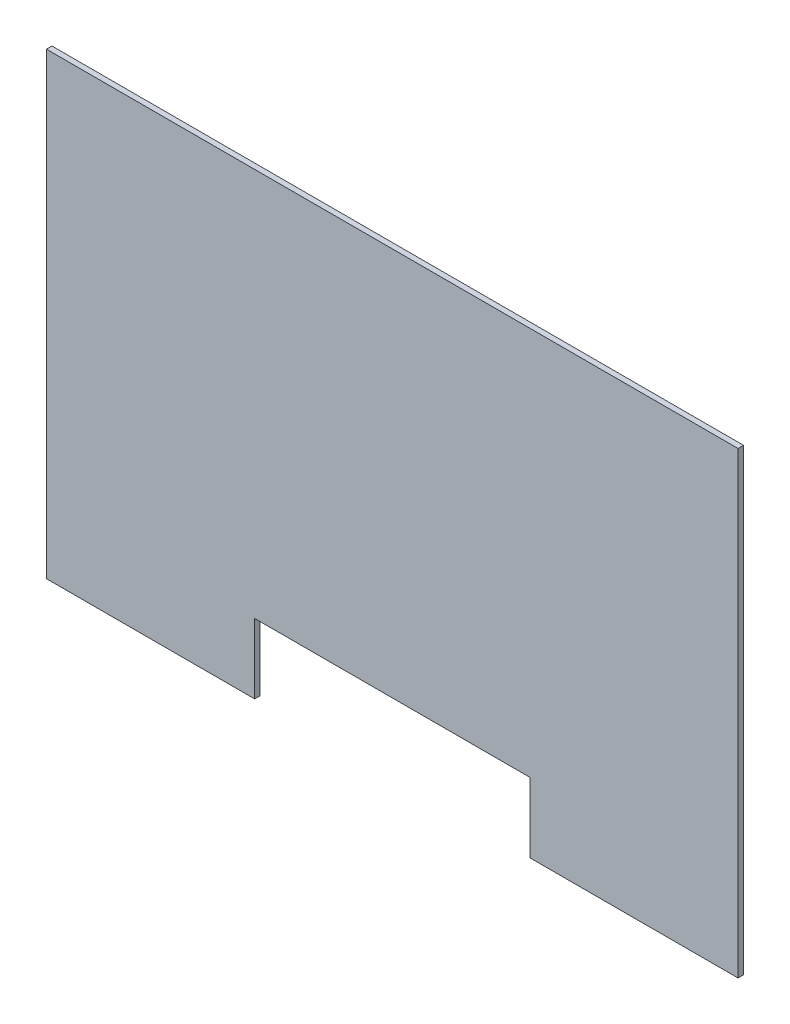
ISO-10303-21;
HEADER;
FILE_DESCRIPTION(('STEP AP214'),'2;1');
FILE_NAME('part.step','',(''),(''),'','','');
FILE_SCHEMA(('AUTOMOTIVE_DESIGN { 1 0 10303 214 1 1 1 1 }'));
ENDSEC;
DATA;
#1=APPLICATION_CONTEXT('core data for automotive mechanical design processes');
#2=APPLICATION_PROTOCOL_DEFINITION('international standard','automotive_design',2000,#1);
#3=PRODUCT_CONTEXT('',#1,'mechanical');
#4=PRODUCT('Part','Part','',(#3));
#5=PRODUCT_RELATED_PRODUCT_CATEGORY('part','',(#4));
#6=PRODUCT_DEFINITION_FORMATION('','',#4);
#7=PRODUCT_DEFINITION_CONTEXT('part definition',#1,'design');
#8=PRODUCT_DEFINITION('design','',#6,#7);
#9=PRODUCT_DEFINITION_SHAPE('','',#8);
#10=(LENGTH_UNIT() NAMED_UNIT(*) SI_UNIT(.MILLI.,.METRE.));
#11=(NAMED_UNIT(*) PLANE_ANGLE_UNIT() SI_UNIT($,.RADIAN.));
#12=(NAMED_UNIT(*) SI_UNIT($,.STERADIAN.) SOLID_ANGLE_UNIT());
#13=UNCERTAINTY_MEASURE_WITH_UNIT(LENGTH_MEASURE(1.E-05),#10,'distance_accuracy_value','');
#14=(GEOMETRIC_REPRESENTATION_CONTEXT(3) GLOBAL_UNCERTAINTY_ASSIGNED_CONTEXT((#13)) GLOBAL_UNIT_ASSIGNED_CONTEXT((#10,
#11,#12)) REPRESENTATION_CONTEXT('',''));
#15=CARTESIAN_POINT('',(0.,0.,0.));
#16=DIRECTION('',(0.,0.,1.));
#17=DIRECTION('',(1.,0.,0.));
#18=AXIS2_PLACEMENT_3D('',#15,#16,#17);
#19=CARTESIAN_POINT('',(-18.85,-12.5,0.3));
#20=DIRECTION('',(0.,1.,0.));
#21=DIRECTION('',(0.,0.,1.));
#22=AXIS2_PLACEMENT_3D('',#19,#20,#21);
#23=PLANE('',#22);
#24=DIRECTION('',(1.,0.,0.));
#25=VECTOR('',#24,1.);
#26=CARTESIAN_POINT('',(-18.85,-12.5,0.));
#27=LINE('',#26,#25);
#28=CARTESIAN_POINT('',(-18.85,-12.5,0.));
#29=VERTEX_POINT('',#28);
#30=CARTESIAN_POINT('',(-7.5,-12.5,0.));
#31=VERTEX_POINT('',#30);
#32=EDGE_CURVE('E125',#29,#31,#27,.T.);
#33=ORIENTED_EDGE('',*,*,#32,.T.);
#34=DIRECTION('',(0.,0.,-1.));
#35=VECTOR('',#34,1.);
#36=CARTESIAN_POINT('',(-7.5,-12.5,-0.00100000000000002));
#37=LINE('',#36,#35);
#38=CARTESIAN_POINT('',(-7.5,-12.5,0.3));
#39=VERTEX_POINT('',#38);
#40=EDGE_CURVE('E112',#39,#31,#37,.T.);
#41=ORIENTED_EDGE('',*,*,#40,.F.);
#42=DIRECTION('',(1.,0.,0.));
#43=VECTOR('',#42,1.);
#44=CARTESIAN_POINT('',(-18.85,-12.5,0.3));
#45=LINE('',#44,#43);
#46=CARTESIAN_POINT('',(-18.85,-12.5,0.3));
#47=VERTEX_POINT('',#46);
#48=EDGE_CURVE('E123',#47,#39,#45,.T.);
#49=ORIENTED_EDGE('',*,*,#48,.F.);
#50=DIRECTION('',(0.,0.,-1.));
#51=VECTOR('',#50,1.);
#52=CARTESIAN_POINT('',(-18.85,-12.5,0.3));
#53=LINE('',#52,#51);
#54=EDGE_CURVE('E135',#47,#29,#53,.T.);
#55=ORIENTED_EDGE('',*,*,#54,.T.);
#56=EDGE_LOOP('',(#33,#41,#49,#55));
#57=FACE_BOUND('',#56,.T.);
#58=ADVANCED_FACE('F36',(#57),#23,.F.);
#59=CARTESIAN_POINT('',(18.85,-12.5,0.3));
#60=DIRECTION('',(-1.,0.,0.));
#61=DIRECTION('',(0.,0.,1.));
#62=AXIS2_PLACEMENT_3D('',#59,#60,#61);
#63=PLANE('',#62);
#64=DIRECTION('',(0.,1.,0.));
#65=VECTOR('',#64,1.);
#66=CARTESIAN_POINT('',(18.85,-12.5,0.));
#67=LINE('',#66,#65);
#68=CARTESIAN_POINT('',(18.85,-12.5,0.));
#69=VERTEX_POINT('',#68);
#70=CARTESIAN_POINT('',(18.85,12.5,0.));
#71=VERTEX_POINT('',#70);
#72=EDGE_CURVE('E140',#69,#71,#67,.T.);
#73=ORIENTED_EDGE('',*,*,#72,.T.);
#74=DIRECTION('',(0.,0.,-1.));
#75=VECTOR('',#74,1.);
#76=CARTESIAN_POINT('',(18.85,12.5,0.3));
#77=LINE('',#76,#75);
#78=CARTESIAN_POINT('',(18.85,12.5,0.3));
#79=VERTEX_POINT('',#78);
#80=EDGE_CURVE('E11',#79,#71,#77,.T.);
#81=ORIENTED_EDGE('',*,*,#80,.F.);
#82=DIRECTION('',(0.,1.,0.));
#83=VECTOR('',#82,1.);
#84=CARTESIAN_POINT('',(18.85,-12.5,0.3));
#85=LINE('',#84,#83);
#86=CARTESIAN_POINT('',(18.85,-12.5,0.3));
#87=VERTEX_POINT('',#86);
#88=EDGE_CURVE('E148',#87,#79,#85,.T.);
#89=ORIENTED_EDGE('',*,*,#88,.F.);
#90=DIRECTION('',(0.,0.,-1.));
#91=VECTOR('',#90,1.);
#92=CARTESIAN_POINT('',(18.85,-12.5,0.3));
#93=LINE('',#92,#91);
#94=EDGE_CURVE('E133',#87,#69,#93,.T.);
#95=ORIENTED_EDGE('',*,*,#94,.T.);
#96=EDGE_LOOP('',(#73,#81,#89,#95));
#97=FACE_BOUND('',#96,.T.);
#98=ADVANCED_FACE('F38',(#97),#63,.F.);
#99=CARTESIAN_POINT('',(-18.85,12.5,0.3));
#100=DIRECTION('',(0.,-1.,0.));
#101=DIRECTION('',(0.,0.,-1.));
#102=AXIS2_PLACEMENT_3D('',#99,#100,#101);
#103=PLANE('',#102);
#104=DIRECTION('',(-1.,0.,0.));
#105=VECTOR('',#104,1.);
#106=CARTESIAN_POINT('',(-18.85,12.5,0.));
#107=LINE('',#106,#105);
#108=CARTESIAN_POINT('',(-18.85,12.5,0.));
#109=VERTEX_POINT('',#108);
#110=EDGE_CURVE('E143',#71,#109,#107,.T.);
#111=ORIENTED_EDGE('',*,*,#110,.T.);
#112=DIRECTION('',(0.,0.,-1.));
#113=VECTOR('',#112,1.);
#114=CARTESIAN_POINT('',(-18.85,12.5,0.3));
#115=LINE('',#114,#113);
#116=CARTESIAN_POINT('',(-18.85,12.5,0.3));
#117=VERTEX_POINT('',#116);
#118=EDGE_CURVE('E44',#117,#109,#115,.T.);
#119=ORIENTED_EDGE('',*,*,#118,.F.);
#120=DIRECTION('',(-1.,0.,0.));
#121=VECTOR('',#120,1.);
#122=CARTESIAN_POINT('',(-18.85,12.5,0.3));
#123=LINE('',#122,#121);
#124=EDGE_CURVE('E89',#79,#117,#123,.T.);
#125=ORIENTED_EDGE('',*,*,#124,.F.);
#126=ORIENTED_EDGE('',*,*,#80,.T.);
#127=EDGE_LOOP('',(#111,#119,#125,#126));
#128=FACE_BOUND('',#127,.T.);
#129=ADVANCED_FACE('F174',(#128),#103,.F.);
#130=CARTESIAN_POINT('',(-18.85,-12.5,0.3));
#131=DIRECTION('',(1.,0.,0.));
#132=DIRECTION('',(0.,0.,-1.));
#133=AXIS2_PLACEMENT_3D('',#130,#131,#132);
#134=PLANE('',#133);
#135=DIRECTION('',(0.,-1.,0.));
#136=VECTOR('',#135,1.);
#137=CARTESIAN_POINT('',(-18.85,-12.5,0.));
#138=LINE('',#137,#136);
#139=EDGE_CURVE('E146',#109,#29,#138,.T.);
#140=ORIENTED_EDGE('',*,*,#139,.T.);
#141=ORIENTED_EDGE('',*,*,#54,.F.);
#142=DIRECTION('',(0.,-1.,0.));
#143=VECTOR('',#142,1.);
#144=CARTESIAN_POINT('',(-18.85,-12.5,0.3));
#145=LINE('',#144,#143);
#146=EDGE_CURVE('E131',#117,#47,#145,.T.);
#147=ORIENTED_EDGE('',*,*,#146,.F.);
#148=ORIENTED_EDGE('',*,*,#118,.T.);
#149=EDGE_LOOP('',(#140,#141,#147,#148));
#150=FACE_BOUND('',#149,.T.);
#151=ADVANCED_FACE('F153',(#150),#134,.F.);
#152=CARTESIAN_POINT('',(7.5,-12.5,0.3));
#153=VERTEX_POINT('',#152);
#154=EDGE_CURVE('E60',#153,#87,#45,.T.);
#155=ORIENTED_EDGE('',*,*,#154,.F.);
#156=DIRECTION('',(0.,0.,1.));
#157=VECTOR('',#156,1.);
#158=CARTESIAN_POINT('',(7.5,-12.5,-0.00100000000000002));
#159=LINE('',#158,#157);
#160=CARTESIAN_POINT('',(7.5,-12.5,0.));
#161=VERTEX_POINT('',#160);
#162=EDGE_CURVE('E127',#161,#153,#159,.T.);
#163=ORIENTED_EDGE('',*,*,#162,.F.);
#164=EDGE_CURVE('E82',#161,#69,#27,.T.);
#165=ORIENTED_EDGE('',*,*,#164,.T.);
#166=ORIENTED_EDGE('',*,*,#94,.F.);
#167=EDGE_LOOP('',(#155,#163,#165,#166));
#168=FACE_BOUND('',#167,.T.);
#169=ADVANCED_FACE('F180',(#168),#23,.F.);
#170=CARTESIAN_POINT('',(0.,0.,0.3));
#171=DIRECTION('',(0.,0.,-1.));
#172=DIRECTION('',(-1.,0.,0.));
#173=AXIS2_PLACEMENT_3D('',#170,#171,#172);
#174=PLANE('',#173);
#175=ORIENTED_EDGE('',*,*,#48,.T.);
#176=DIRECTION('',(0.,-1.,0.));
#177=VECTOR('',#176,1.);
#178=CARTESIAN_POINT('',(-7.5,-8.7,0.3));
#179=LINE('',#178,#177);
#180=CARTESIAN_POINT('',(-7.5,-8.7,0.3));
#181=VERTEX_POINT('',#180);
#182=EDGE_CURVE('E109',#181,#39,#179,.T.);
#183=ORIENTED_EDGE('',*,*,#182,.F.);
#184=DIRECTION('',(-1.,0.,0.));
#185=VECTOR('',#184,1.);
#186=CARTESIAN_POINT('',(-7.5,-8.7,0.3));
#187=LINE('',#186,#185);
#188=CARTESIAN_POINT('',(7.5,-8.7,0.3));
#189=VERTEX_POINT('',#188);
#190=EDGE_CURVE('E165',#189,#181,#187,.T.);
#191=ORIENTED_EDGE('',*,*,#190,.F.);
#192=DIRECTION('',(0.,1.,0.));
#193=VECTOR('',#192,1.);
#194=CARTESIAN_POINT('',(7.5,-8.7,0.3));
#195=LINE('',#194,#193);
#196=EDGE_CURVE('E117',#153,#189,#195,.T.);
#197=ORIENTED_EDGE('',*,*,#196,.F.);
#198=ORIENTED_EDGE('',*,*,#154,.T.);
#199=ORIENTED_EDGE('',*,*,#88,.T.);
#200=ORIENTED_EDGE('',*,*,#124,.T.);
#201=ORIENTED_EDGE('',*,*,#146,.T.);
#202=EDGE_LOOP('',(#175,#183,#191,#197,#198,#199,#200,#201));
#203=FACE_BOUND('',#202,.T.);
#204=ADVANCED_FACE('F129',(#203),#174,.F.);
#205=CARTESIAN_POINT('',(0.,0.,0.));
#206=DIRECTION('',(0.,0.,-1.));
#207=DIRECTION('',(-1.,0.,0.));
#208=AXIS2_PLACEMENT_3D('',#205,#206,#207);
#209=PLANE('',#208);
#210=DIRECTION('',(0.,-1.,0.));
#211=VECTOR('',#210,1.);
#212=CARTESIAN_POINT('',(-7.5,-8.7,0.));
#213=LINE('',#212,#211);
#214=CARTESIAN_POINT('',(-7.5,-8.7,0.));
#215=VERTEX_POINT('',#214);
#216=EDGE_CURVE('E51',#215,#31,#213,.T.);
#217=ORIENTED_EDGE('',*,*,#216,.T.);
#218=ORIENTED_EDGE('',*,*,#32,.F.);
#219=ORIENTED_EDGE('',*,*,#139,.F.);
#220=ORIENTED_EDGE('',*,*,#110,.F.);
#221=ORIENTED_EDGE('',*,*,#72,.F.);
#222=ORIENTED_EDGE('',*,*,#164,.F.);
#223=DIRECTION('',(0.,1.,0.));
#224=VECTOR('',#223,1.);
#225=CARTESIAN_POINT('',(7.5,-8.7,0.));
#226=LINE('',#225,#224);
#227=CARTESIAN_POINT('',(7.5,-8.7,0.));
#228=VERTEX_POINT('',#227);
#229=EDGE_CURVE('E144',#161,#228,#226,.T.);
#230=ORIENTED_EDGE('',*,*,#229,.T.);
#231=DIRECTION('',(-1.,0.,0.));
#232=VECTOR('',#231,1.);
#233=CARTESIAN_POINT('',(-7.5,-8.7,0.));
#234=LINE('',#233,#232);
#235=EDGE_CURVE('E126',#228,#215,#234,.T.);
#236=ORIENTED_EDGE('',*,*,#235,.T.);
#237=EDGE_LOOP('',(#217,#218,#219,#220,#221,#222,#230,#236));
#238=FACE_BOUND('',#237,.T.);
#239=ADVANCED_FACE('F155',(#238),#209,.T.);
#240=CARTESIAN_POINT('',(-7.5,-8.7,-0.00100000000000002));
#241=DIRECTION('',(-1.,0.,0.));
#242=DIRECTION('',(0.,-1.,0.));
#243=AXIS2_PLACEMENT_3D('',#240,#241,#242);
#244=PLANE('',#243);
#245=ORIENTED_EDGE('',*,*,#40,.T.);
#246=ORIENTED_EDGE('',*,*,#216,.F.);
#247=DIRECTION('',(0.,0.,1.));
#248=VECTOR('',#247,1.);
#249=CARTESIAN_POINT('',(-7.5,-8.7,-0.00100000000000002));
#250=LINE('',#249,#248);
#251=EDGE_CURVE('E113',#215,#181,#250,.T.);
#252=ORIENTED_EDGE('',*,*,#251,.T.);
#253=ORIENTED_EDGE('',*,*,#182,.T.);
#254=EDGE_LOOP('',(#245,#246,#252,#253));
#255=FACE_BOUND('',#254,.T.);
#256=ADVANCED_FACE('F111',(#255),#244,.F.);
#257=CARTESIAN_POINT('',(7.5,-8.7,-0.00100000000000002));
#258=DIRECTION('',(1.,0.,0.));
#259=DIRECTION('',(0.,1.,0.));
#260=AXIS2_PLACEMENT_3D('',#257,#258,#259);
#261=PLANE('',#260);
#262=ORIENTED_EDGE('',*,*,#162,.T.);
#263=ORIENTED_EDGE('',*,*,#196,.T.);
#264=DIRECTION('',(0.,0.,1.));
#265=VECTOR('',#264,1.);
#266=CARTESIAN_POINT('',(7.5,-8.7,-0.00100000000000002));
#267=LINE('',#266,#265);
#268=EDGE_CURVE('E167',#228,#189,#267,.T.);
#269=ORIENTED_EDGE('',*,*,#268,.F.);
#270=ORIENTED_EDGE('',*,*,#229,.F.);
#271=EDGE_LOOP('',(#262,#263,#269,#270));
#272=FACE_BOUND('',#271,.T.);
#273=ADVANCED_FACE('F193',(#272),#261,.F.);
#274=CARTESIAN_POINT('',(-7.5,-8.7,-0.00100000000000002));
#275=DIRECTION('',(0.,1.,0.));
#276=DIRECTION('',(0.,0.,1.));
#277=AXIS2_PLACEMENT_3D('',#274,#275,#276);
#278=PLANE('',#277);
#279=ORIENTED_EDGE('',*,*,#268,.T.);
#280=ORIENTED_EDGE('',*,*,#190,.T.);
#281=ORIENTED_EDGE('',*,*,#251,.F.);
#282=ORIENTED_EDGE('',*,*,#235,.F.);
#283=EDGE_LOOP('',(#279,#280,#281,#282));
#284=FACE_BOUND('',#283,.T.);
#285=ADVANCED_FACE('F195',(#284),#278,.F.);
#286=CLOSED_SHELL('',(#58,#98,#129,#151,#169,#204,#239,#256,#273,#285));
#287=MANIFOLD_SOLID_BREP('B2',#286);
#288=ADVANCED_BREP_SHAPE_REPRESENTATION('',(#18,#287),#14);
#289=SHAPE_DEFINITION_REPRESENTATION(#9,#288);
ENDSEC;
END-ISO-10303-21;
